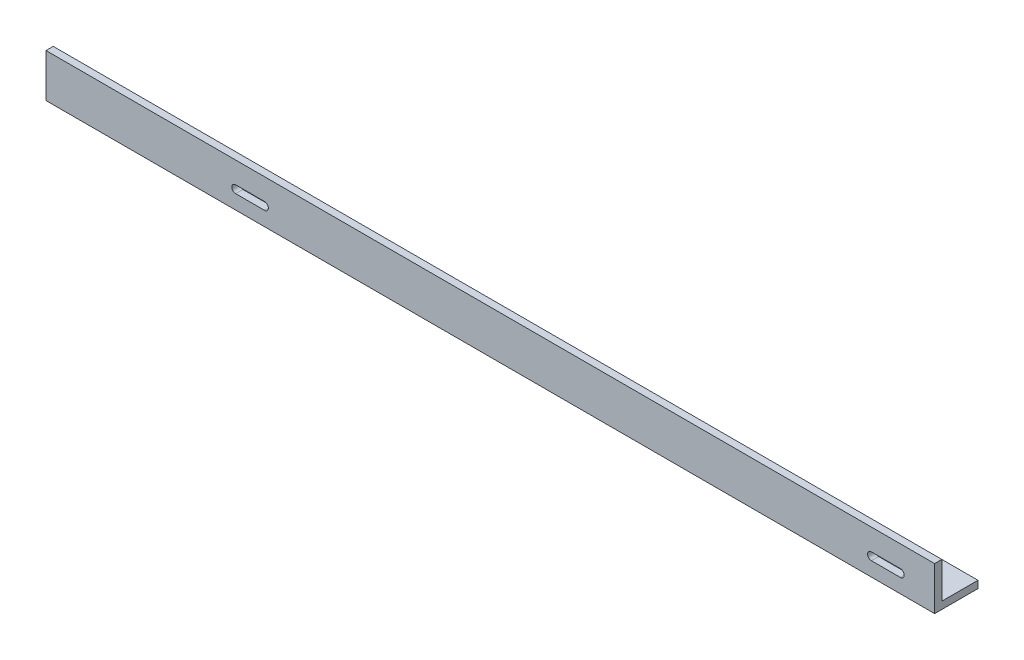
ISO-10303-21;
HEADER;
FILE_DESCRIPTION(('STEP AP214'),'2;1');
FILE_NAME('part.step','',(''),(''),'','','');
FILE_SCHEMA(('AUTOMOTIVE_DESIGN { 1 0 10303 214 1 1 1 1 }'));
ENDSEC;
DATA;
#1=APPLICATION_CONTEXT('core data for automotive mechanical design processes');
#2=APPLICATION_PROTOCOL_DEFINITION('international standard','automotive_design',2000,#1);
#3=PRODUCT_CONTEXT('',#1,'mechanical');
#4=PRODUCT('Part','Part','',(#3));
#5=PRODUCT_RELATED_PRODUCT_CATEGORY('part','',(#4));
#6=PRODUCT_DEFINITION_FORMATION('','',#4);
#7=PRODUCT_DEFINITION_CONTEXT('part definition',#1,'design');
#8=PRODUCT_DEFINITION('design','',#6,#7);
#9=PRODUCT_DEFINITION_SHAPE('','',#8);
#10=(LENGTH_UNIT() NAMED_UNIT(*) SI_UNIT(.MILLI.,.METRE.));
#11=(NAMED_UNIT(*) PLANE_ANGLE_UNIT() SI_UNIT($,.RADIAN.));
#12=(NAMED_UNIT(*) SI_UNIT($,.STERADIAN.) SOLID_ANGLE_UNIT());
#13=UNCERTAINTY_MEASURE_WITH_UNIT(LENGTH_MEASURE(1.E-05),#10,'distance_accuracy_value','');
#14=(GEOMETRIC_REPRESENTATION_CONTEXT(3) GLOBAL_UNCERTAINTY_ASSIGNED_CONTEXT((#13)) GLOBAL_UNIT_ASSIGNED_CONTEXT((#10,
#11,#12)) REPRESENTATION_CONTEXT('',''));
#15=CARTESIAN_POINT('',(0.,0.,0.));
#16=DIRECTION('',(0.,0.,1.));
#17=DIRECTION('',(1.,0.,0.));
#18=AXIS2_PLACEMENT_3D('',#15,#16,#17);
#19=CARTESIAN_POINT('',(0.,6.35,-38.1));
#20=DIRECTION('',(0.,1.,0.));
#21=DIRECTION('',(0.,0.,1.));
#22=AXIS2_PLACEMENT_3D('',#19,#20,#21);
#23=PLANE('',#22);
#24=DIRECTION('',(0.,0.,-1.));
#25=VECTOR('',#24,1.);
#26=CARTESIAN_POINT('',(781.05,6.35,0.));
#27=LINE('',#26,#25);
#28=CARTESIAN_POINT('',(781.05,6.35,-38.1));
#29=VERTEX_POINT('',#28);
#30=CARTESIAN_POINT('',(781.05,6.35,-6.35));
#31=VERTEX_POINT('',#30);
#32=EDGE_CURVE('E205',#29,#31,#27,.F.);
#33=ORIENTED_EDGE('',*,*,#32,.F.);
#34=DIRECTION('',(-1.,0.,0.));
#35=VECTOR('',#34,1.);
#36=CARTESIAN_POINT('',(0.,6.35,-38.1));
#37=LINE('',#36,#35);
#38=CARTESIAN_POINT('',(0.,6.35,-38.1));
#39=VERTEX_POINT('',#38);
#40=EDGE_CURVE('E211',#39,#29,#37,.F.);
#41=ORIENTED_EDGE('',*,*,#40,.F.);
#42=DIRECTION('',(0.,0.,-1.));
#43=VECTOR('',#42,1.);
#44=CARTESIAN_POINT('',(0.,6.35,0.));
#45=LINE('',#44,#43);
#46=CARTESIAN_POINT('',(0.,6.35,-6.35));
#47=VERTEX_POINT('',#46);
#48=EDGE_CURVE('E150',#39,#47,#45,.F.);
#49=ORIENTED_EDGE('',*,*,#48,.T.);
#50=DIRECTION('',(-1.,0.,0.));
#51=VECTOR('',#50,1.);
#52=CARTESIAN_POINT('',(0.,6.35,-6.35));
#53=LINE('',#52,#51);
#54=EDGE_CURVE('E144',#31,#47,#53,.T.);
#55=ORIENTED_EDGE('',*,*,#54,.F.);
#56=EDGE_LOOP('',(#33,#41,#49,#55));
#57=FACE_BOUND('',#56,.T.);
#58=ADVANCED_FACE('F16',(#57),#23,.T.);
#59=CARTESIAN_POINT('',(0.,6.35,-6.35));
#60=DIRECTION('',(0.,0.,-1.));
#61=DIRECTION('',(-1.,0.,0.));
#62=AXIS2_PLACEMENT_3D('',#59,#60,#61);
#63=PLANE('',#62);
#64=CARTESIAN_POINT('',(750.8748,15.875,-6.35));
#65=DIRECTION('',(0.,0.,1.));
#66=DIRECTION('',(1.,0.,0.));
#67=AXIS2_PLACEMENT_3D('',#64,#65,#66);
#68=CIRCLE('',#67,3.3655);
#69=CARTESIAN_POINT('',(750.8748,12.5095,-6.35));
#70=VERTEX_POINT('',#69);
#71=CARTESIAN_POINT('',(750.8748,19.2405,-6.35));
#72=VERTEX_POINT('',#71);
#73=EDGE_CURVE('E175',#70,#72,#68,.T.);
#74=ORIENTED_EDGE('',*,*,#73,.T.);
#75=DIRECTION('',(1.,0.,0.));
#76=VECTOR('',#75,1.);
#77=CARTESIAN_POINT('',(750.8748,19.2405,-6.35));
#78=LINE('',#77,#76);
#79=CARTESIAN_POINT('',(725.4748,19.2405,-6.35));
#80=VERTEX_POINT('',#79);
#81=EDGE_CURVE('E152',#72,#80,#78,.F.);
#82=ORIENTED_EDGE('',*,*,#81,.T.);
#83=CARTESIAN_POINT('',(725.4748,15.875,-6.35));
#84=DIRECTION('',(0.,0.,1.));
#85=DIRECTION('',(1.,0.,0.));
#86=AXIS2_PLACEMENT_3D('',#83,#84,#85);
#87=CIRCLE('',#86,3.3655);
#88=CARTESIAN_POINT('',(725.4748,12.5095,-6.35));
#89=VERTEX_POINT('',#88);
#90=EDGE_CURVE('E158',#80,#89,#87,.T.);
#91=ORIENTED_EDGE('',*,*,#90,.T.);
#92=DIRECTION('',(1.,0.,0.));
#93=VECTOR('',#92,1.);
#94=CARTESIAN_POINT('',(725.4748,12.5095,-6.35));
#95=LINE('',#94,#93);
#96=EDGE_CURVE('E147',#89,#70,#95,.T.);
#97=ORIENTED_EDGE('',*,*,#96,.T.);
#98=EDGE_LOOP('',(#74,#82,#91,#97));
#99=FACE_BOUND('',#98,.T.);
#100=CARTESIAN_POINT('',(192.0748,15.875,-6.35));
#101=DIRECTION('',(0.,0.,1.));
#102=DIRECTION('',(1.,0.,0.));
#103=AXIS2_PLACEMENT_3D('',#100,#101,#102);
#104=CIRCLE('',#103,3.3655);
#105=CARTESIAN_POINT('',(192.0748,12.5095,-6.35));
#106=VERTEX_POINT('',#105);
#107=CARTESIAN_POINT('',(192.0748,19.2405,-6.35));
#108=VERTEX_POINT('',#107);
#109=EDGE_CURVE('E129',#106,#108,#104,.T.);
#110=ORIENTED_EDGE('',*,*,#109,.T.);
#111=DIRECTION('',(1.,0.,0.));
#112=VECTOR('',#111,1.);
#113=CARTESIAN_POINT('',(192.0748,19.2405,-6.35));
#114=LINE('',#113,#112);
#115=CARTESIAN_POINT('',(166.6748,19.2405,-6.35));
#116=VERTEX_POINT('',#115);
#117=EDGE_CURVE('E126',#108,#116,#114,.F.);
#118=ORIENTED_EDGE('',*,*,#117,.T.);
#119=CARTESIAN_POINT('',(166.6748,15.875,-6.35));
#120=DIRECTION('',(0.,0.,1.));
#121=DIRECTION('',(1.,0.,0.));
#122=AXIS2_PLACEMENT_3D('',#119,#120,#121);
#123=CIRCLE('',#122,3.3655);
#124=CARTESIAN_POINT('',(166.6748,12.5095,-6.35));
#125=VERTEX_POINT('',#124);
#126=EDGE_CURVE('E19',#116,#125,#123,.T.);
#127=ORIENTED_EDGE('',*,*,#126,.T.);
#128=DIRECTION('',(1.,0.,0.));
#129=VECTOR('',#128,1.);
#130=CARTESIAN_POINT('',(166.6748,12.5095,-6.35));
#131=LINE('',#130,#129);
#132=EDGE_CURVE('E157',#125,#106,#131,.T.);
#133=ORIENTED_EDGE('',*,*,#132,.T.);
#134=EDGE_LOOP('',(#110,#118,#127,#133));
#135=FACE_BOUND('',#134,.T.);
#136=DIRECTION('',(0.,1.,0.));
#137=VECTOR('',#136,1.);
#138=CARTESIAN_POINT('',(781.05,0.,-6.35));
#139=LINE('',#138,#137);
#140=CARTESIAN_POINT('',(781.05,38.1,-6.35));
#141=VERTEX_POINT('',#140);
#142=EDGE_CURVE('E202',#31,#141,#139,.T.);
#143=ORIENTED_EDGE('',*,*,#142,.F.);
#144=ORIENTED_EDGE('',*,*,#54,.T.);
#145=DIRECTION('',(0.,1.,0.));
#146=VECTOR('',#145,1.);
#147=CARTESIAN_POINT('',(0.,0.,-6.35));
#148=LINE('',#147,#146);
#149=CARTESIAN_POINT('',(0.,38.1,-6.35));
#150=VERTEX_POINT('',#149);
#151=EDGE_CURVE('E218',#47,#150,#148,.T.);
#152=ORIENTED_EDGE('',*,*,#151,.T.);
#153=DIRECTION('',(1.,0.,0.));
#154=VECTOR('',#153,1.);
#155=CARTESIAN_POINT('',(0.,38.1,-6.35));
#156=LINE('',#155,#154);
#157=EDGE_CURVE('E124',#141,#150,#156,.F.);
#158=ORIENTED_EDGE('',*,*,#157,.F.);
#159=EDGE_LOOP('',(#143,#144,#152,#158));
#160=FACE_BOUND('',#159,.T.);
#161=ADVANCED_FACE('F127',(#99,#135,#160),#63,.T.);
#162=CARTESIAN_POINT('',(0.,38.1,-6.35));
#163=DIRECTION('',(0.,1.,0.));
#164=DIRECTION('',(0.,0.,1.));
#165=AXIS2_PLACEMENT_3D('',#162,#163,#164);
#166=PLANE('',#165);
#167=DIRECTION('',(0.,0.,-1.));
#168=VECTOR('',#167,1.);
#169=CARTESIAN_POINT('',(781.05,38.1,0.));
#170=LINE('',#169,#168);
#171=CARTESIAN_POINT('',(781.05,38.1,0.));
#172=VERTEX_POINT('',#171);
#173=EDGE_CURVE('E200',#141,#172,#170,.F.);
#174=ORIENTED_EDGE('',*,*,#173,.F.);
#175=ORIENTED_EDGE('',*,*,#157,.T.);
#176=DIRECTION('',(0.,0.,-1.));
#177=VECTOR('',#176,1.);
#178=CARTESIAN_POINT('',(0.,38.1,0.));
#179=LINE('',#178,#177);
#180=CARTESIAN_POINT('',(0.,38.1,0.));
#181=VERTEX_POINT('',#180);
#182=EDGE_CURVE('E216',#150,#181,#179,.F.);
#183=ORIENTED_EDGE('',*,*,#182,.T.);
#184=DIRECTION('',(1.,0.,0.));
#185=VECTOR('',#184,1.);
#186=CARTESIAN_POINT('',(0.,38.1,0.));
#187=LINE('',#186,#185);
#188=EDGE_CURVE('E174',#172,#181,#187,.F.);
#189=ORIENTED_EDGE('',*,*,#188,.F.);
#190=EDGE_LOOP('',(#174,#175,#183,#189));
#191=FACE_BOUND('',#190,.T.);
#192=ADVANCED_FACE('F263',(#191),#166,.T.);
#193=CARTESIAN_POINT('',(166.6748,15.875,0.));
#194=DIRECTION('',(0.,0.,1.));
#195=DIRECTION('',(1.,0.,0.));
#196=AXIS2_PLACEMENT_3D('',#193,#194,#195);
#197=CYLINDRICAL_SURFACE('',#196,3.3655);
#198=DIRECTION('',(0.,0.,1.));
#199=VECTOR('',#198,1.);
#200=CARTESIAN_POINT('',(166.6748,19.2405,0.));
#201=LINE('',#200,#199);
#202=CARTESIAN_POINT('',(166.6748,19.2405,0.));
#203=VERTEX_POINT('',#202);
#204=EDGE_CURVE('E117',#116,#203,#201,.T.);
#205=ORIENTED_EDGE('',*,*,#204,.T.);
#206=CARTESIAN_POINT('',(166.6748,15.875,0.));
#207=DIRECTION('',(0.,0.,1.));
#208=DIRECTION('',(1.,0.,0.));
#209=AXIS2_PLACEMENT_3D('',#206,#207,#208);
#210=CIRCLE('',#209,3.3655);
#211=CARTESIAN_POINT('',(166.6748,12.5095,0.));
#212=VERTEX_POINT('',#211);
#213=EDGE_CURVE('E172',#212,#203,#210,.F.);
#214=ORIENTED_EDGE('',*,*,#213,.F.);
#215=DIRECTION('',(0.,0.,-1.));
#216=VECTOR('',#215,1.);
#217=CARTESIAN_POINT('',(166.6748,12.5095,0.));
#218=LINE('',#217,#216);
#219=EDGE_CURVE('E120',#212,#125,#218,.T.);
#220=ORIENTED_EDGE('',*,*,#219,.T.);
#221=ORIENTED_EDGE('',*,*,#126,.F.);
#222=EDGE_LOOP('',(#205,#214,#220,#221));
#223=FACE_BOUND('',#222,.T.);
#224=ADVANCED_FACE('F115',(#223),#197,.F.);
#225=CARTESIAN_POINT('',(192.0748,19.2405,0.));
#226=DIRECTION('',(0.,1.,0.));
#227=DIRECTION('',(0.,0.,1.));
#228=AXIS2_PLACEMENT_3D('',#225,#226,#227);
#229=PLANE('',#228);
#230=DIRECTION('',(0.,0.,1.));
#231=VECTOR('',#230,1.);
#232=CARTESIAN_POINT('',(192.0748,19.2405,0.));
#233=LINE('',#232,#231);
#234=CARTESIAN_POINT('',(192.0748,19.2405,0.));
#235=VERTEX_POINT('',#234);
#236=EDGE_CURVE('E132',#108,#235,#233,.T.);
#237=ORIENTED_EDGE('',*,*,#236,.T.);
#238=DIRECTION('',(1.,0.,0.));
#239=VECTOR('',#238,1.);
#240=CARTESIAN_POINT('',(0.,19.2405,0.));
#241=LINE('',#240,#239);
#242=EDGE_CURVE('E136',#203,#235,#241,.T.);
#243=ORIENTED_EDGE('',*,*,#242,.F.);
#244=ORIENTED_EDGE('',*,*,#204,.F.);
#245=ORIENTED_EDGE('',*,*,#117,.F.);
#246=EDGE_LOOP('',(#237,#243,#244,#245));
#247=FACE_BOUND('',#246,.T.);
#248=ADVANCED_FACE('F134',(#247),#229,.F.);
#249=CARTESIAN_POINT('',(192.0748,15.875,0.));
#250=DIRECTION('',(0.,0.,1.));
#251=DIRECTION('',(1.,0.,0.));
#252=AXIS2_PLACEMENT_3D('',#249,#250,#251);
#253=CYLINDRICAL_SURFACE('',#252,3.3655);
#254=DIRECTION('',(0.,0.,-1.));
#255=VECTOR('',#254,1.);
#256=CARTESIAN_POINT('',(192.0748,12.5095,0.));
#257=LINE('',#256,#255);
#258=CARTESIAN_POINT('',(192.0748,12.5095,0.));
#259=VERTEX_POINT('',#258);
#260=EDGE_CURVE('E179',#106,#259,#257,.F.);
#261=ORIENTED_EDGE('',*,*,#260,.T.);
#262=CARTESIAN_POINT('',(192.0748,15.875,0.));
#263=DIRECTION('',(0.,0.,1.));
#264=DIRECTION('',(1.,0.,0.));
#265=AXIS2_PLACEMENT_3D('',#262,#263,#264);
#266=CIRCLE('',#265,3.3655);
#267=EDGE_CURVE('E169',#235,#259,#266,.F.);
#268=ORIENTED_EDGE('',*,*,#267,.F.);
#269=ORIENTED_EDGE('',*,*,#236,.F.);
#270=ORIENTED_EDGE('',*,*,#109,.F.);
#271=EDGE_LOOP('',(#261,#268,#269,#270));
#272=FACE_BOUND('',#271,.T.);
#273=ADVANCED_FACE('F183',(#272),#253,.F.);
#274=CARTESIAN_POINT('',(166.6748,12.5095,0.));
#275=DIRECTION('',(0.,-1.,0.));
#276=DIRECTION('',(0.,0.,-1.));
#277=AXIS2_PLACEMENT_3D('',#274,#275,#276);
#278=PLANE('',#277);
#279=ORIENTED_EDGE('',*,*,#219,.F.);
#280=DIRECTION('',(1.,0.,0.));
#281=VECTOR('',#280,1.);
#282=CARTESIAN_POINT('',(0.,12.5095,0.));
#283=LINE('',#282,#281);
#284=EDGE_CURVE('E168',#259,#212,#283,.F.);
#285=ORIENTED_EDGE('',*,*,#284,.F.);
#286=ORIENTED_EDGE('',*,*,#260,.F.);
#287=ORIENTED_EDGE('',*,*,#132,.F.);
#288=EDGE_LOOP('',(#279,#285,#286,#287));
#289=FACE_BOUND('',#288,.T.);
#290=ADVANCED_FACE('F346',(#289),#278,.F.);
#291=CARTESIAN_POINT('',(725.4748,15.875,0.));
#292=DIRECTION('',(0.,0.,1.));
#293=DIRECTION('',(1.,0.,0.));
#294=AXIS2_PLACEMENT_3D('',#291,#292,#293);
#295=CYLINDRICAL_SURFACE('',#294,3.3655);
#296=DIRECTION('',(0.,0.,1.));
#297=VECTOR('',#296,1.);
#298=CARTESIAN_POINT('',(725.4748,19.2405,0.));
#299=LINE('',#298,#297);
#300=CARTESIAN_POINT('',(725.4748,19.2405,0.));
#301=VERTEX_POINT('',#300);
#302=EDGE_CURVE('E156',#80,#301,#299,.T.);
#303=ORIENTED_EDGE('',*,*,#302,.T.);
#304=CARTESIAN_POINT('',(725.4748,15.875,0.));
#305=DIRECTION('',(0.,0.,1.));
#306=DIRECTION('',(1.,0.,0.));
#307=AXIS2_PLACEMENT_3D('',#304,#305,#306);
#308=CIRCLE('',#307,3.3655);
#309=CARTESIAN_POINT('',(725.4748,12.5095,0.));
#310=VERTEX_POINT('',#309);
#311=EDGE_CURVE('E165',#310,#301,#308,.F.);
#312=ORIENTED_EDGE('',*,*,#311,.F.);
#313=DIRECTION('',(0.,0.,-1.));
#314=VECTOR('',#313,1.);
#315=CARTESIAN_POINT('',(725.4748,12.5095,0.));
#316=LINE('',#315,#314);
#317=EDGE_CURVE('E151',#310,#89,#316,.T.);
#318=ORIENTED_EDGE('',*,*,#317,.T.);
#319=ORIENTED_EDGE('',*,*,#90,.F.);
#320=EDGE_LOOP('',(#303,#312,#318,#319));
#321=FACE_BOUND('',#320,.T.);
#322=ADVANCED_FACE('F228',(#321),#295,.F.);
#323=CARTESIAN_POINT('',(750.8748,19.2405,0.));
#324=DIRECTION('',(0.,1.,0.));
#325=DIRECTION('',(0.,0.,1.));
#326=AXIS2_PLACEMENT_3D('',#323,#324,#325);
#327=PLANE('',#326);
#328=DIRECTION('',(0.,0.,1.));
#329=VECTOR('',#328,1.);
#330=CARTESIAN_POINT('',(750.8748,19.2405,0.));
#331=LINE('',#330,#329);
#332=CARTESIAN_POINT('',(750.8748,19.2405,0.));
#333=VERTEX_POINT('',#332);
#334=EDGE_CURVE('E155',#72,#333,#331,.T.);
#335=ORIENTED_EDGE('',*,*,#334,.T.);
#336=DIRECTION('',(1.,0.,0.));
#337=VECTOR('',#336,1.);
#338=CARTESIAN_POINT('',(0.,19.2405,0.));
#339=LINE('',#338,#337);
#340=EDGE_CURVE('E164',#301,#333,#339,.T.);
#341=ORIENTED_EDGE('',*,*,#340,.F.);
#342=ORIENTED_EDGE('',*,*,#302,.F.);
#343=ORIENTED_EDGE('',*,*,#81,.F.);
#344=EDGE_LOOP('',(#335,#341,#342,#343));
#345=FACE_BOUND('',#344,.T.);
#346=ADVANCED_FACE('F232',(#345),#327,.F.);
#347=CARTESIAN_POINT('',(750.8748,15.875,0.));
#348=DIRECTION('',(0.,0.,1.));
#349=DIRECTION('',(1.,0.,0.));
#350=AXIS2_PLACEMENT_3D('',#347,#348,#349);
#351=CYLINDRICAL_SURFACE('',#350,3.3655);
#352=DIRECTION('',(0.,0.,-1.));
#353=VECTOR('',#352,1.);
#354=CARTESIAN_POINT('',(750.8748,12.5095,0.));
#355=LINE('',#354,#353);
#356=CARTESIAN_POINT('',(750.8748,12.5095,0.));
#357=VERTEX_POINT('',#356);
#358=EDGE_CURVE('E178',#70,#357,#355,.F.);
#359=ORIENTED_EDGE('',*,*,#358,.T.);
#360=CARTESIAN_POINT('',(750.8748,15.875,0.));
#361=DIRECTION('',(0.,0.,1.));
#362=DIRECTION('',(1.,0.,0.));
#363=AXIS2_PLACEMENT_3D('',#360,#361,#362);
#364=CIRCLE('',#363,3.3655);
#365=EDGE_CURVE('E160',#333,#357,#364,.F.);
#366=ORIENTED_EDGE('',*,*,#365,.F.);
#367=ORIENTED_EDGE('',*,*,#334,.F.);
#368=ORIENTED_EDGE('',*,*,#73,.F.);
#369=EDGE_LOOP('',(#359,#366,#367,#368));
#370=FACE_BOUND('',#369,.T.);
#371=ADVANCED_FACE('F277',(#370),#351,.F.);
#372=CARTESIAN_POINT('',(725.4748,12.5095,0.));
#373=DIRECTION('',(0.,-1.,0.));
#374=DIRECTION('',(0.,0.,-1.));
#375=AXIS2_PLACEMENT_3D('',#372,#373,#374);
#376=PLANE('',#375);
#377=ORIENTED_EDGE('',*,*,#317,.F.);
#378=DIRECTION('',(1.,0.,0.));
#379=VECTOR('',#378,1.);
#380=CARTESIAN_POINT('',(0.,12.5095,0.));
#381=LINE('',#380,#379);
#382=EDGE_CURVE('E163',#357,#310,#381,.F.);
#383=ORIENTED_EDGE('',*,*,#382,.F.);
#384=ORIENTED_EDGE('',*,*,#358,.F.);
#385=ORIENTED_EDGE('',*,*,#96,.F.);
#386=EDGE_LOOP('',(#377,#383,#384,#385));
#387=FACE_BOUND('',#386,.T.);
#388=ADVANCED_FACE('F269',(#387),#376,.F.);
#389=CARTESIAN_POINT('',(0.,0.,0.));
#390=DIRECTION('',(1.,0.,0.));
#391=DIRECTION('',(0.,0.,-1.));
#392=AXIS2_PLACEMENT_3D('',#389,#390,#391);
#393=PLANE('',#392);
#394=DIRECTION('',(0.,1.,0.));
#395=VECTOR('',#394,1.);
#396=CARTESIAN_POINT('',(0.,38.1,0.));
#397=LINE('',#396,#395);
#398=CARTESIAN_POINT('',(0.,0.,0.));
#399=VERTEX_POINT('',#398);
#400=EDGE_CURVE('E197',#181,#399,#397,.F.);
#401=ORIENTED_EDGE('',*,*,#400,.F.);
#402=ORIENTED_EDGE('',*,*,#182,.F.);
#403=ORIENTED_EDGE('',*,*,#151,.F.);
#404=ORIENTED_EDGE('',*,*,#48,.F.);
#405=DIRECTION('',(0.,1.,0.));
#406=VECTOR('',#405,1.);
#407=CARTESIAN_POINT('',(0.,0.,-38.1));
#408=LINE('',#407,#406);
#409=CARTESIAN_POINT('',(0.,0.,-38.1));
#410=VERTEX_POINT('',#409);
#411=EDGE_CURVE('E213',#410,#39,#408,.T.);
#412=ORIENTED_EDGE('',*,*,#411,.F.);
#413=DIRECTION('',(0.,0.,-1.));
#414=VECTOR('',#413,1.);
#415=CARTESIAN_POINT('',(0.,0.,0.));
#416=LINE('',#415,#414);
#417=EDGE_CURVE('E240',#399,#410,#416,.T.);
#418=ORIENTED_EDGE('',*,*,#417,.F.);
#419=EDGE_LOOP('',(#401,#402,#403,#404,#412,#418));
#420=FACE_BOUND('',#419,.T.);
#421=ADVANCED_FACE('F267',(#420),#393,.F.);
#422=CARTESIAN_POINT('',(0.,0.,-38.1));
#423=DIRECTION('',(0.,0.,-1.));
#424=DIRECTION('',(-1.,0.,0.));
#425=AXIS2_PLACEMENT_3D('',#422,#423,#424);
#426=PLANE('',#425);
#427=DIRECTION('',(0.,1.,0.));
#428=VECTOR('',#427,1.);
#429=CARTESIAN_POINT('',(781.05,0.,-38.1));
#430=LINE('',#429,#428);
#431=CARTESIAN_POINT('',(781.05,0.,-38.1));
#432=VERTEX_POINT('',#431);
#433=EDGE_CURVE('E208',#432,#29,#430,.T.);
#434=ORIENTED_EDGE('',*,*,#433,.F.);
#435=DIRECTION('',(1.,0.,0.));
#436=VECTOR('',#435,1.);
#437=CARTESIAN_POINT('',(0.,0.,-38.1));
#438=LINE('',#437,#436);
#439=EDGE_CURVE('E243',#410,#432,#438,.T.);
#440=ORIENTED_EDGE('',*,*,#439,.F.);
#441=ORIENTED_EDGE('',*,*,#411,.T.);
#442=ORIENTED_EDGE('',*,*,#40,.T.);
#443=EDGE_LOOP('',(#434,#440,#441,#442));
#444=FACE_BOUND('',#443,.T.);
#445=ADVANCED_FACE('F255',(#444),#426,.T.);
#446=CARTESIAN_POINT('',(781.05,0.,0.));
#447=DIRECTION('',(1.,0.,0.));
#448=DIRECTION('',(0.,0.,-1.));
#449=AXIS2_PLACEMENT_3D('',#446,#447,#448);
#450=PLANE('',#449);
#451=ORIENTED_EDGE('',*,*,#173,.T.);
#452=DIRECTION('',(0.,1.,0.));
#453=VECTOR('',#452,1.);
#454=CARTESIAN_POINT('',(781.05,38.1,0.));
#455=LINE('',#454,#453);
#456=CARTESIAN_POINT('',(781.05,0.,0.));
#457=VERTEX_POINT('',#456);
#458=EDGE_CURVE('E34',#457,#172,#455,.T.);
#459=ORIENTED_EDGE('',*,*,#458,.F.);
#460=DIRECTION('',(0.,0.,-1.));
#461=VECTOR('',#460,1.);
#462=CARTESIAN_POINT('',(781.05,0.,0.));
#463=LINE('',#462,#461);
#464=EDGE_CURVE('E25',#432,#457,#463,.F.);
#465=ORIENTED_EDGE('',*,*,#464,.F.);
#466=ORIENTED_EDGE('',*,*,#433,.T.);
#467=ORIENTED_EDGE('',*,*,#32,.T.);
#468=ORIENTED_EDGE('',*,*,#142,.T.);
#469=EDGE_LOOP('',(#451,#459,#465,#466,#467,#468));
#470=FACE_BOUND('',#469,.T.);
#471=ADVANCED_FACE('F252',(#470),#450,.T.);
#472=CARTESIAN_POINT('',(0.,38.1,0.));
#473=DIRECTION('',(0.,0.,1.));
#474=DIRECTION('',(1.,0.,0.));
#475=AXIS2_PLACEMENT_3D('',#472,#473,#474);
#476=PLANE('',#475);
#477=ORIENTED_EDGE('',*,*,#365,.T.);
#478=ORIENTED_EDGE('',*,*,#382,.T.);
#479=ORIENTED_EDGE('',*,*,#311,.T.);
#480=ORIENTED_EDGE('',*,*,#340,.T.);
#481=EDGE_LOOP('',(#477,#478,#479,#480));
#482=FACE_BOUND('',#481,.T.);
#483=ORIENTED_EDGE('',*,*,#267,.T.);
#484=ORIENTED_EDGE('',*,*,#284,.T.);
#485=ORIENTED_EDGE('',*,*,#213,.T.);
#486=ORIENTED_EDGE('',*,*,#242,.T.);
#487=EDGE_LOOP('',(#483,#484,#485,#486));
#488=FACE_BOUND('',#487,.T.);
#489=ORIENTED_EDGE('',*,*,#458,.T.);
#490=ORIENTED_EDGE('',*,*,#188,.T.);
#491=ORIENTED_EDGE('',*,*,#400,.T.);
#492=DIRECTION('',(1.,0.,0.));
#493=VECTOR('',#492,1.);
#494=CARTESIAN_POINT('',(0.,0.,0.));
#495=LINE('',#494,#493);
#496=EDGE_CURVE('E11',#457,#399,#495,.F.);
#497=ORIENTED_EDGE('',*,*,#496,.F.);
#498=EDGE_LOOP('',(#489,#490,#491,#497));
#499=FACE_BOUND('',#498,.T.);
#500=ADVANCED_FACE('F188',(#482,#488,#499),#476,.T.);
#501=CARTESIAN_POINT('',(0.,0.,0.));
#502=DIRECTION('',(0.,-1.,0.));
#503=DIRECTION('',(0.,0.,-1.));
#504=AXIS2_PLACEMENT_3D('',#501,#502,#503);
#505=PLANE('',#504);
#506=ORIENTED_EDGE('',*,*,#464,.T.);
#507=ORIENTED_EDGE('',*,*,#496,.T.);
#508=ORIENTED_EDGE('',*,*,#417,.T.);
#509=ORIENTED_EDGE('',*,*,#439,.T.);
#510=EDGE_LOOP('',(#506,#507,#508,#509));
#511=FACE_BOUND('',#510,.T.);
#512=ADVANCED_FACE('F250',(#511),#505,.T.);
#513=CLOSED_SHELL('',(#58,#161,#192,#224,#248,#273,#290,#322,#346,#371,#388,#421,#445,#471,#500,#512));
#514=MANIFOLD_SOLID_BREP('B1',#513);
#515=ADVANCED_BREP_SHAPE_REPRESENTATION('',(#18,#514),#14);
#516=SHAPE_DEFINITION_REPRESENTATION(#9,#515);
ENDSEC;
END-ISO-10303-21;
